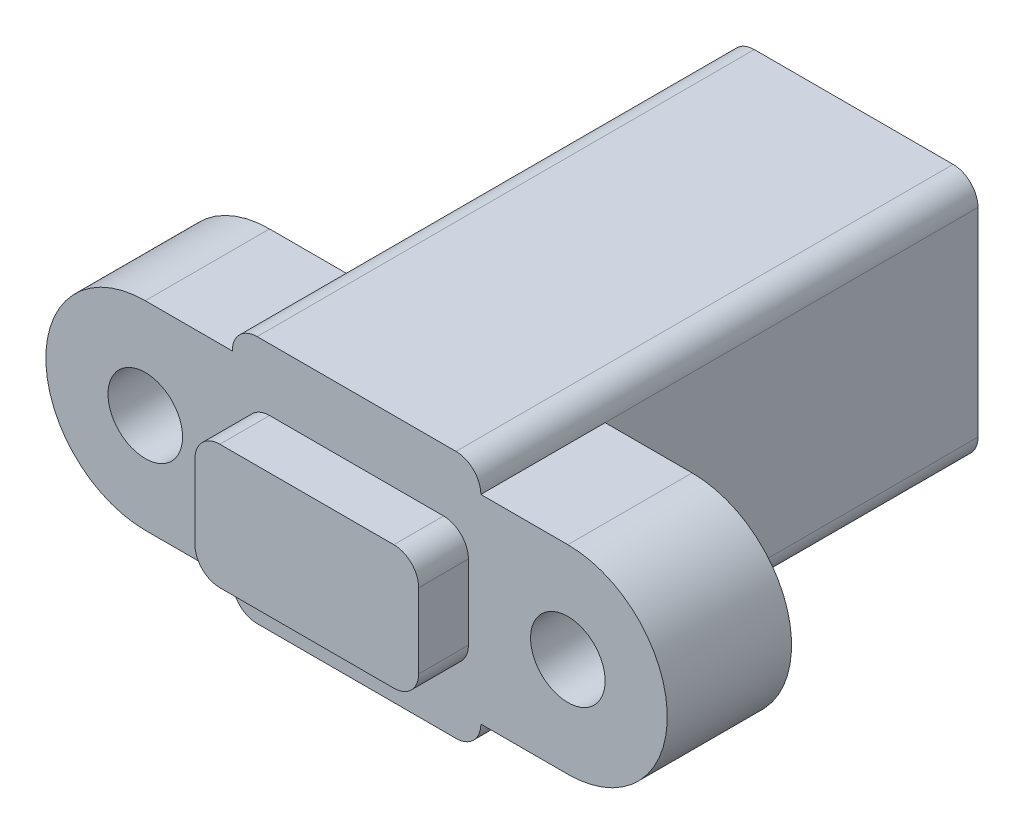
ISO-10303-21;
HEADER;
FILE_DESCRIPTION(('STEP AP214'),'2;1');
FILE_NAME('part.step','',(''),(''),'','','');
FILE_SCHEMA(('AUTOMOTIVE_DESIGN { 1 0 10303 214 1 1 1 1 }'));
ENDSEC;
DATA;
#1=APPLICATION_CONTEXT('core data for automotive mechanical design processes');
#2=APPLICATION_PROTOCOL_DEFINITION('international standard','automotive_design',2000,#1);
#3=PRODUCT_CONTEXT('',#1,'mechanical');
#4=PRODUCT('Part','Part','',(#3));
#5=PRODUCT_RELATED_PRODUCT_CATEGORY('part','',(#4));
#6=PRODUCT_DEFINITION_FORMATION('','',#4);
#7=PRODUCT_DEFINITION_CONTEXT('part definition',#1,'design');
#8=PRODUCT_DEFINITION('design','',#6,#7);
#9=PRODUCT_DEFINITION_SHAPE('','',#8);
#10=(LENGTH_UNIT() NAMED_UNIT(*) SI_UNIT(.MILLI.,.METRE.));
#11=(NAMED_UNIT(*) PLANE_ANGLE_UNIT() SI_UNIT($,.RADIAN.));
#12=(NAMED_UNIT(*) SI_UNIT($,.STERADIAN.) SOLID_ANGLE_UNIT());
#13=UNCERTAINTY_MEASURE_WITH_UNIT(LENGTH_MEASURE(1.E-05),#10,'distance_accuracy_value','');
#14=(GEOMETRIC_REPRESENTATION_CONTEXT(3) GLOBAL_UNCERTAINTY_ASSIGNED_CONTEXT((#13)) GLOBAL_UNIT_ASSIGNED_CONTEXT((#10,
#11,#12)) REPRESENTATION_CONTEXT('',''));
#15=CARTESIAN_POINT('',(0.,0.,0.));
#16=DIRECTION('',(0.,0.,1.));
#17=DIRECTION('',(1.,0.,0.));
#18=AXIS2_PLACEMENT_3D('',#15,#16,#17);
#19=CARTESIAN_POINT('',(0.,0.,0.));
#20=DIRECTION('',(0.,0.,1.));
#21=DIRECTION('',(1.,0.,0.));
#22=AXIS2_PLACEMENT_3D('',#19,#20,#21);
#23=PLANE('',#22);
#24=CARTESIAN_POINT('',(0.,0.,0.));
#25=DIRECTION('',(0.,0.,1.));
#26=DIRECTION('',(1.,0.,0.));
#27=AXIS2_PLACEMENT_3D('',#24,#25,#26);
#28=CIRCLE('',#27,1.5);
#29=CARTESIAN_POINT('',(1.5,0.,0.));
#30=VERTEX_POINT('',#29);
#31=EDGE_CURVE('E303',#30,#30,#28,.T.);
#32=ORIENTED_EDGE('',*,*,#31,.T.);
#33=EDGE_LOOP('',(#32));
#34=FACE_BOUND('',#33,.T.);
#35=DIRECTION('',(0.,-1.,0.));
#36=VECTOR('',#35,1.);
#37=CARTESIAN_POINT('',(-3.5,0.,0.));
#38=LINE('',#37,#36);
#39=CARTESIAN_POINT('',(-3.5,4.,0.));
#40=VERTEX_POINT('',#39);
#41=CARTESIAN_POINT('',(-3.5,-4.,0.));
#42=VERTEX_POINT('',#41);
#43=EDGE_CURVE('E201',#40,#42,#38,.T.);
#44=ORIENTED_EDGE('',*,*,#43,.F.);
#45=DIRECTION('',(-1.,0.,0.));
#46=VECTOR('',#45,1.);
#47=CARTESIAN_POINT('',(0.,4.,0.));
#48=LINE('',#47,#46);
#49=CARTESIAN_POINT('',(0.,4.,0.));
#50=VERTEX_POINT('',#49);
#51=EDGE_CURVE('E337',#50,#40,#48,.T.);
#52=ORIENTED_EDGE('',*,*,#51,.F.);
#53=CARTESIAN_POINT('',(0.,0.,0.));
#54=DIRECTION('',(0.,0.,1.));
#55=DIRECTION('',(1.,0.,0.));
#56=AXIS2_PLACEMENT_3D('',#53,#54,#55);
#57=CIRCLE('',#56,4.);
#58=CARTESIAN_POINT('',(0.,-4.,0.));
#59=VERTEX_POINT('',#58);
#60=EDGE_CURVE('E335',#59,#50,#57,.T.);
#61=ORIENTED_EDGE('',*,*,#60,.F.);
#62=DIRECTION('',(-1.,0.,0.));
#63=VECTOR('',#62,1.);
#64=CARTESIAN_POINT('',(0.,-4.,0.));
#65=LINE('',#64,#63);
#66=EDGE_CURVE('E299',#59,#42,#65,.T.);
#67=ORIENTED_EDGE('',*,*,#66,.T.);
#68=EDGE_LOOP('',(#44,#52,#61,#67));
#69=FACE_BOUND('',#68,.T.);
#70=ADVANCED_FACE('F35',(#34,#69),#23,.F.);
#71=CARTESIAN_POINT('',(-4.5,-4.,5.));
#72=DIRECTION('',(0.,0.,-1.));
#73=DIRECTION('',(-1.,0.,0.));
#74=AXIS2_PLACEMENT_3D('',#71,#72,#73);
#75=CYLINDRICAL_SURFACE('',#74,1.);
#76=DIRECTION('',(0.,0.,-1.));
#77=VECTOR('',#76,1.);
#78=CARTESIAN_POINT('',(-4.50000000000001,-5.,5.));
#79=LINE('',#78,#77);
#80=CARTESIAN_POINT('',(-4.50000000000001,-5.,5.));
#81=VERTEX_POINT('',#80);
#82=CARTESIAN_POINT('',(-4.50000000000001,-5.,-15.));
#83=VERTEX_POINT('',#82);
#84=EDGE_CURVE('E333',#81,#83,#79,.T.);
#85=ORIENTED_EDGE('',*,*,#84,.T.);
#86=CARTESIAN_POINT('',(-4.5,-4.,-15.));
#87=DIRECTION('',(0.,0.,1.));
#88=DIRECTION('',(1.,0.,0.));
#89=AXIS2_PLACEMENT_3D('',#86,#87,#88);
#90=CIRCLE('',#89,1.);
#91=CARTESIAN_POINT('',(-3.5,-4.,-15.));
#92=VERTEX_POINT('',#91);
#93=EDGE_CURVE('E217',#83,#92,#90,.T.);
#94=ORIENTED_EDGE('',*,*,#93,.T.);
#95=DIRECTION('',(0.,0.,1.));
#96=VECTOR('',#95,1.);
#97=CARTESIAN_POINT('',(-3.5,-4.,-15.));
#98=LINE('',#97,#96);
#99=EDGE_CURVE('E232',#92,#42,#98,.T.);
#100=ORIENTED_EDGE('',*,*,#99,.T.);
#101=DIRECTION('',(0.,0.,-1.));
#102=VECTOR('',#101,1.);
#103=CARTESIAN_POINT('',(-3.5,-4.,5.));
#104=LINE('',#103,#102);
#105=CARTESIAN_POINT('',(-3.5,-4.,5.));
#106=VERTEX_POINT('',#105);
#107=EDGE_CURVE('E11',#106,#42,#104,.T.);
#108=ORIENTED_EDGE('',*,*,#107,.F.);
#109=CARTESIAN_POINT('',(-4.5,-4.,5.));
#110=DIRECTION('',(0.,0.,1.));
#111=DIRECTION('',(1.,0.,0.));
#112=AXIS2_PLACEMENT_3D('',#109,#110,#111);
#113=CIRCLE('',#112,1.);
#114=EDGE_CURVE('E300',#81,#106,#113,.T.);
#115=ORIENTED_EDGE('',*,*,#114,.F.);
#116=EDGE_LOOP('',(#85,#94,#100,#108,#115));
#117=FACE_BOUND('',#116,.T.);
#118=ADVANCED_FACE('F37',(#117),#75,.T.);
#119=CARTESIAN_POINT('',(0.,-4.,5.));
#120=DIRECTION('',(0.,-1.,0.));
#121=DIRECTION('',(1.,0.,0.));
#122=AXIS2_PLACEMENT_3D('',#119,#120,#121);
#123=PLANE('',#122);
#124=ORIENTED_EDGE('',*,*,#66,.F.);
#125=DIRECTION('',(0.,0.,-1.));
#126=VECTOR('',#125,1.);
#127=CARTESIAN_POINT('',(0.,-4.,5.));
#128=LINE('',#127,#126);
#129=CARTESIAN_POINT('',(0.,-4.,5.));
#130=VERTEX_POINT('',#129);
#131=EDGE_CURVE('E43',#130,#59,#128,.T.);
#132=ORIENTED_EDGE('',*,*,#131,.F.);
#133=DIRECTION('',(-1.,0.,0.));
#134=VECTOR('',#133,1.);
#135=CARTESIAN_POINT('',(0.,-4.,5.));
#136=LINE('',#135,#134);
#137=EDGE_CURVE('E302',#130,#106,#136,.T.);
#138=ORIENTED_EDGE('',*,*,#137,.T.);
#139=ORIENTED_EDGE('',*,*,#107,.T.);
#140=EDGE_LOOP('',(#124,#132,#138,#139));
#141=FACE_BOUND('',#140,.T.);
#142=ADVANCED_FACE('F381',(#141),#123,.T.);
#143=CARTESIAN_POINT('',(0.,0.,5.));
#144=DIRECTION('',(0.,0.,-1.));
#145=DIRECTION('',(-1.,0.,0.));
#146=AXIS2_PLACEMENT_3D('',#143,#144,#145);
#147=CYLINDRICAL_SURFACE('',#146,4.);
#148=ORIENTED_EDGE('',*,*,#60,.T.);
#149=DIRECTION('',(0.,0.,-1.));
#150=VECTOR('',#149,1.);
#151=CARTESIAN_POINT('',(0.,4.,5.));
#152=LINE('',#151,#150);
#153=CARTESIAN_POINT('',(0.,4.,5.));
#154=VERTEX_POINT('',#153);
#155=EDGE_CURVE('E369',#154,#50,#152,.T.);
#156=ORIENTED_EDGE('',*,*,#155,.F.);
#157=CARTESIAN_POINT('',(0.,0.,5.));
#158=DIRECTION('',(0.,0.,1.));
#159=DIRECTION('',(1.,0.,0.));
#160=AXIS2_PLACEMENT_3D('',#157,#158,#159);
#161=CIRCLE('',#160,4.);
#162=EDGE_CURVE('E306',#130,#154,#161,.T.);
#163=ORIENTED_EDGE('',*,*,#162,.F.);
#164=ORIENTED_EDGE('',*,*,#131,.T.);
#165=EDGE_LOOP('',(#148,#156,#163,#164));
#166=FACE_BOUND('',#165,.T.);
#167=ADVANCED_FACE('F374',(#166),#147,.T.);
#168=CARTESIAN_POINT('',(0.,4.,5.));
#169=DIRECTION('',(0.,-1.,0.));
#170=DIRECTION('',(1.,0.,0.));
#171=AXIS2_PLACEMENT_3D('',#168,#169,#170);
#172=PLANE('',#171);
#173=ORIENTED_EDGE('',*,*,#51,.T.);
#174=DIRECTION('',(0.,0.,-1.));
#175=VECTOR('',#174,1.);
#176=CARTESIAN_POINT('',(-3.5,4.,5.));
#177=LINE('',#176,#175);
#178=CARTESIAN_POINT('',(-3.5,4.,5.));
#179=VERTEX_POINT('',#178);
#180=EDGE_CURVE('E366',#179,#40,#177,.T.);
#181=ORIENTED_EDGE('',*,*,#180,.F.);
#182=DIRECTION('',(-1.,0.,0.));
#183=VECTOR('',#182,1.);
#184=CARTESIAN_POINT('',(0.,4.,5.));
#185=LINE('',#184,#183);
#186=EDGE_CURVE('E308',#154,#179,#185,.T.);
#187=ORIENTED_EDGE('',*,*,#186,.F.);
#188=ORIENTED_EDGE('',*,*,#155,.T.);
#189=EDGE_LOOP('',(#173,#181,#187,#188));
#190=FACE_BOUND('',#189,.T.);
#191=ADVANCED_FACE('F397',(#190),#172,.F.);
#192=CARTESIAN_POINT('',(-4.5,4.,5.));
#193=DIRECTION('',(0.,0.,-1.));
#194=DIRECTION('',(-1.,0.,0.));
#195=AXIS2_PLACEMENT_3D('',#192,#193,#194);
#196=CYLINDRICAL_SURFACE('',#195,1.);
#197=ORIENTED_EDGE('',*,*,#180,.T.);
#198=DIRECTION('',(0.,0.,1.));
#199=VECTOR('',#198,1.);
#200=CARTESIAN_POINT('',(-3.5,4.,-15.));
#201=LINE('',#200,#199);
#202=CARTESIAN_POINT('',(-3.5,4.,-15.));
#203=VERTEX_POINT('',#202);
#204=EDGE_CURVE('E229',#203,#40,#201,.T.);
#205=ORIENTED_EDGE('',*,*,#204,.F.);
#206=CARTESIAN_POINT('',(-4.5,4.,-15.));
#207=DIRECTION('',(0.,0.,1.));
#208=DIRECTION('',(1.,0.,0.));
#209=AXIS2_PLACEMENT_3D('',#206,#207,#208);
#210=CIRCLE('',#209,1.);
#211=CARTESIAN_POINT('',(-4.50000000000001,5.,-15.));
#212=VERTEX_POINT('',#211);
#213=EDGE_CURVE('E222',#212,#203,#210,.F.);
#214=ORIENTED_EDGE('',*,*,#213,.F.);
#215=DIRECTION('',(0.,0.,-1.));
#216=VECTOR('',#215,1.);
#217=CARTESIAN_POINT('',(-4.50000000000001,5.,5.));
#218=LINE('',#217,#216);
#219=CARTESIAN_POINT('',(-4.50000000000001,5.,5.));
#220=VERTEX_POINT('',#219);
#221=EDGE_CURVE('E193',#220,#212,#218,.T.);
#222=ORIENTED_EDGE('',*,*,#221,.F.);
#223=CARTESIAN_POINT('',(-4.5,4.,5.));
#224=DIRECTION('',(0.,0.,1.));
#225=DIRECTION('',(1.,0.,0.));
#226=AXIS2_PLACEMENT_3D('',#223,#224,#225);
#227=CIRCLE('',#226,1.);
#228=EDGE_CURVE('E310',#220,#179,#227,.F.);
#229=ORIENTED_EDGE('',*,*,#228,.T.);
#230=EDGE_LOOP('',(#197,#205,#214,#222,#229));
#231=FACE_BOUND('',#230,.T.);
#232=ADVANCED_FACE('F393',(#231),#196,.T.);
#233=CARTESIAN_POINT('',(0.,5.,5.));
#234=DIRECTION('',(0.,1.,0.));
#235=DIRECTION('',(0.,0.,1.));
#236=AXIS2_PLACEMENT_3D('',#233,#234,#235);
#237=PLANE('',#236);
#238=ORIENTED_EDGE('',*,*,#221,.T.);
#239=DIRECTION('',(1.,0.,0.));
#240=VECTOR('',#239,1.);
#241=CARTESIAN_POINT('',(0.,5.,-15.));
#242=LINE('',#241,#240);
#243=CARTESIAN_POINT('',(-12.5,5.,-15.));
#244=VERTEX_POINT('',#243);
#245=EDGE_CURVE('E197',#244,#212,#242,.T.);
#246=ORIENTED_EDGE('',*,*,#245,.F.);
#247=DIRECTION('',(0.,0.,-1.));
#248=VECTOR('',#247,1.);
#249=CARTESIAN_POINT('',(-12.5,5.,5.));
#250=LINE('',#249,#248);
#251=CARTESIAN_POINT('',(-12.5,5.,5.));
#252=VERTEX_POINT('',#251);
#253=EDGE_CURVE('E182',#252,#244,#250,.T.);
#254=ORIENTED_EDGE('',*,*,#253,.F.);
#255=DIRECTION('',(1.,0.,0.));
#256=VECTOR('',#255,1.);
#257=CARTESIAN_POINT('',(0.,5.,5.));
#258=LINE('',#257,#256);
#259=EDGE_CURVE('E313',#252,#220,#258,.T.);
#260=ORIENTED_EDGE('',*,*,#259,.T.);
#261=EDGE_LOOP('',(#238,#246,#254,#260));
#262=FACE_BOUND('',#261,.T.);
#263=ADVANCED_FACE('F198',(#262),#237,.T.);
#264=CARTESIAN_POINT('',(-12.5,4.,5.));
#265=DIRECTION('',(0.,0.,-1.));
#266=DIRECTION('',(-1.,0.,0.));
#267=AXIS2_PLACEMENT_3D('',#264,#265,#266);
#268=CYLINDRICAL_SURFACE('',#267,1.);
#269=ORIENTED_EDGE('',*,*,#253,.T.);
#270=CARTESIAN_POINT('',(-12.5,4.,-15.));
#271=DIRECTION('',(0.,0.,1.));
#272=DIRECTION('',(1.,0.,0.));
#273=AXIS2_PLACEMENT_3D('',#270,#271,#272);
#274=CIRCLE('',#273,1.);
#275=CARTESIAN_POINT('',(-13.5,4.,-15.));
#276=VERTEX_POINT('',#275);
#277=EDGE_CURVE('E187',#244,#276,#274,.T.);
#278=ORIENTED_EDGE('',*,*,#277,.T.);
#279=DIRECTION('',(0.,0.,1.));
#280=VECTOR('',#279,1.);
#281=CARTESIAN_POINT('',(-13.5,4.,-15.));
#282=LINE('',#281,#280);
#283=CARTESIAN_POINT('',(-13.5,4.,0.));
#284=VERTEX_POINT('',#283);
#285=EDGE_CURVE('E224',#276,#284,#282,.T.);
#286=ORIENTED_EDGE('',*,*,#285,.T.);
#287=DIRECTION('',(0.,0.,-1.));
#288=VECTOR('',#287,1.);
#289=CARTESIAN_POINT('',(-13.5,4.,5.));
#290=LINE('',#289,#288);
#291=CARTESIAN_POINT('',(-13.5,4.,5.));
#292=VERTEX_POINT('',#291);
#293=EDGE_CURVE('E194',#292,#284,#290,.T.);
#294=ORIENTED_EDGE('',*,*,#293,.F.);
#295=CARTESIAN_POINT('',(-12.5,4.,5.));
#296=DIRECTION('',(0.,0.,1.));
#297=DIRECTION('',(1.,0.,0.));
#298=AXIS2_PLACEMENT_3D('',#295,#296,#297);
#299=CIRCLE('',#298,1.);
#300=EDGE_CURVE('E189',#252,#292,#299,.T.);
#301=ORIENTED_EDGE('',*,*,#300,.F.);
#302=EDGE_LOOP('',(#269,#278,#286,#294,#301));
#303=FACE_BOUND('',#302,.T.);
#304=ADVANCED_FACE('F184',(#303),#268,.T.);
#305=CARTESIAN_POINT('',(0.,4.,5.));
#306=DIRECTION('',(0.,-1.,0.));
#307=DIRECTION('',(1.,0.,0.));
#308=AXIS2_PLACEMENT_3D('',#305,#306,#307);
#309=PLANE('',#308);
#310=DIRECTION('',(-1.,0.,0.));
#311=VECTOR('',#310,1.);
#312=CARTESIAN_POINT('',(0.,4.,0.));
#313=LINE('',#312,#311);
#314=CARTESIAN_POINT('',(-17.,4.,0.));
#315=VERTEX_POINT('',#314);
#316=EDGE_CURVE('E340',#284,#315,#313,.T.);
#317=ORIENTED_EDGE('',*,*,#316,.T.);
#318=DIRECTION('',(0.,0.,-1.));
#319=VECTOR('',#318,1.);
#320=CARTESIAN_POINT('',(-17.,4.,5.));
#321=LINE('',#320,#319);
#322=CARTESIAN_POINT('',(-17.,4.,5.));
#323=VERTEX_POINT('',#322);
#324=EDGE_CURVE('E361',#323,#315,#321,.T.);
#325=ORIENTED_EDGE('',*,*,#324,.F.);
#326=DIRECTION('',(-1.,0.,0.));
#327=VECTOR('',#326,1.);
#328=CARTESIAN_POINT('',(0.,4.,5.));
#329=LINE('',#328,#327);
#330=EDGE_CURVE('E316',#292,#323,#329,.T.);
#331=ORIENTED_EDGE('',*,*,#330,.F.);
#332=ORIENTED_EDGE('',*,*,#293,.T.);
#333=EDGE_LOOP('',(#317,#325,#331,#332));
#334=FACE_BOUND('',#333,.T.);
#335=ADVANCED_FACE('F418',(#334),#309,.F.);
#336=CARTESIAN_POINT('',(-17.,0.,5.));
#337=DIRECTION('',(0.,0.,-1.));
#338=DIRECTION('',(-1.,0.,0.));
#339=AXIS2_PLACEMENT_3D('',#336,#337,#338);
#340=CYLINDRICAL_SURFACE('',#339,4.);
#341=CARTESIAN_POINT('',(-17.,0.,0.));
#342=DIRECTION('',(0.,0.,1.));
#343=DIRECTION('',(1.,0.,0.));
#344=AXIS2_PLACEMENT_3D('',#341,#342,#343);
#345=CIRCLE('',#344,4.);
#346=CARTESIAN_POINT('',(-17.,-4.,0.));
#347=VERTEX_POINT('',#346);
#348=EDGE_CURVE('E342',#315,#347,#345,.T.);
#349=ORIENTED_EDGE('',*,*,#348,.T.);
#350=DIRECTION('',(0.,0.,-1.));
#351=VECTOR('',#350,1.);
#352=CARTESIAN_POINT('',(-17.,-4.,5.));
#353=LINE('',#352,#351);
#354=CARTESIAN_POINT('',(-17.,-4.,5.));
#355=VERTEX_POINT('',#354);
#356=EDGE_CURVE('E359',#355,#347,#353,.T.);
#357=ORIENTED_EDGE('',*,*,#356,.F.);
#358=CARTESIAN_POINT('',(-17.,0.,5.));
#359=DIRECTION('',(0.,0.,1.));
#360=DIRECTION('',(1.,0.,0.));
#361=AXIS2_PLACEMENT_3D('',#358,#359,#360);
#362=CIRCLE('',#361,4.);
#363=EDGE_CURVE('E318',#323,#355,#362,.T.);
#364=ORIENTED_EDGE('',*,*,#363,.F.);
#365=ORIENTED_EDGE('',*,*,#324,.T.);
#366=EDGE_LOOP('',(#349,#357,#364,#365));
#367=FACE_BOUND('',#366,.T.);
#368=ADVANCED_FACE('F422',(#367),#340,.T.);
#369=CARTESIAN_POINT('',(0.,-4.,5.));
#370=DIRECTION('',(0.,-1.,0.));
#371=DIRECTION('',(1.,0.,0.));
#372=AXIS2_PLACEMENT_3D('',#369,#370,#371);
#373=PLANE('',#372);
#374=DIRECTION('',(-1.,0.,0.));
#375=VECTOR('',#374,1.);
#376=CARTESIAN_POINT('',(0.,-4.,0.));
#377=LINE('',#376,#375);
#378=CARTESIAN_POINT('',(-13.5,-4.,0.));
#379=VERTEX_POINT('',#378);
#380=EDGE_CURVE('E345',#379,#347,#377,.T.);
#381=ORIENTED_EDGE('',*,*,#380,.F.);
#382=DIRECTION('',(0.,0.,-1.));
#383=VECTOR('',#382,1.);
#384=CARTESIAN_POINT('',(-13.5,-4.,5.));
#385=LINE('',#384,#383);
#386=CARTESIAN_POINT('',(-13.5,-4.,5.));
#387=VERTEX_POINT('',#386);
#388=EDGE_CURVE('E356',#387,#379,#385,.T.);
#389=ORIENTED_EDGE('',*,*,#388,.F.);
#390=DIRECTION('',(-1.,0.,0.));
#391=VECTOR('',#390,1.);
#392=CARTESIAN_POINT('',(0.,-4.,5.));
#393=LINE('',#392,#391);
#394=EDGE_CURVE('E320',#387,#355,#393,.T.);
#395=ORIENTED_EDGE('',*,*,#394,.T.);
#396=ORIENTED_EDGE('',*,*,#356,.T.);
#397=EDGE_LOOP('',(#381,#389,#395,#396));
#398=FACE_BOUND('',#397,.T.);
#399=ADVANCED_FACE('F426',(#398),#373,.T.);
#400=CARTESIAN_POINT('',(-12.5,-4.,5.));
#401=DIRECTION('',(0.,0.,-1.));
#402=DIRECTION('',(-1.,0.,0.));
#403=AXIS2_PLACEMENT_3D('',#400,#401,#402);
#404=CYLINDRICAL_SURFACE('',#403,0.999999999999999);
#405=ORIENTED_EDGE('',*,*,#388,.T.);
#406=DIRECTION('',(0.,0.,1.));
#407=VECTOR('',#406,1.);
#408=CARTESIAN_POINT('',(-13.5,-4.,-15.));
#409=LINE('',#408,#407);
#410=CARTESIAN_POINT('',(-13.5,-4.,-15.));
#411=VERTEX_POINT('',#410);
#412=EDGE_CURVE('E235',#411,#379,#409,.T.);
#413=ORIENTED_EDGE('',*,*,#412,.F.);
#414=CARTESIAN_POINT('',(-12.5,-4.,-15.));
#415=DIRECTION('',(0.,0.,1.));
#416=DIRECTION('',(1.,0.,0.));
#417=AXIS2_PLACEMENT_3D('',#414,#415,#416);
#418=CIRCLE('',#417,0.999999999999999);
#419=CARTESIAN_POINT('',(-12.5,-5.,-15.));
#420=VERTEX_POINT('',#419);
#421=EDGE_CURVE('E209',#411,#420,#418,.T.);
#422=ORIENTED_EDGE('',*,*,#421,.T.);
#423=DIRECTION('',(0.,0.,-1.));
#424=VECTOR('',#423,1.);
#425=CARTESIAN_POINT('',(-12.5,-5.,5.));
#426=LINE('',#425,#424);
#427=CARTESIAN_POINT('',(-12.5,-5.,5.));
#428=VERTEX_POINT('',#427);
#429=EDGE_CURVE('E354',#428,#420,#426,.T.);
#430=ORIENTED_EDGE('',*,*,#429,.F.);
#431=CARTESIAN_POINT('',(-12.5,-4.,5.));
#432=DIRECTION('',(0.,0.,1.));
#433=DIRECTION('',(1.,0.,0.));
#434=AXIS2_PLACEMENT_3D('',#431,#432,#433);
#435=CIRCLE('',#434,0.999999999999999);
#436=EDGE_CURVE('E323',#387,#428,#435,.T.);
#437=ORIENTED_EDGE('',*,*,#436,.F.);
#438=EDGE_LOOP('',(#405,#413,#422,#430,#437));
#439=FACE_BOUND('',#438,.T.);
#440=ADVANCED_FACE('F409',(#439),#404,.T.);
#441=CARTESIAN_POINT('',(-17.,0.,5.));
#442=DIRECTION('',(0.,0.,-1.));
#443=DIRECTION('',(-1.,0.,0.));
#444=AXIS2_PLACEMENT_3D('',#441,#442,#443);
#445=CYLINDRICAL_SURFACE('',#444,1.5);
#446=CARTESIAN_POINT('',(-17.,0.,5.));
#447=DIRECTION('',(0.,0.,1.));
#448=DIRECTION('',(1.,0.,0.));
#449=AXIS2_PLACEMENT_3D('',#446,#447,#448);
#450=CIRCLE('',#449,1.5);
#451=CARTESIAN_POINT('',(-15.5,0.,5.));
#452=VERTEX_POINT('',#451);
#453=EDGE_CURVE('E327',#452,#452,#450,.T.);
#454=ORIENTED_EDGE('',*,*,#453,.T.);
#455=EDGE_LOOP('',(#454));
#456=FACE_BOUND('',#455,.T.);
#457=CARTESIAN_POINT('',(-17.,0.,0.));
#458=DIRECTION('',(0.,0.,1.));
#459=DIRECTION('',(1.,0.,0.));
#460=AXIS2_PLACEMENT_3D('',#457,#458,#459);
#461=CIRCLE('',#460,1.5);
#462=CARTESIAN_POINT('',(-15.5,0.,0.));
#463=VERTEX_POINT('',#462);
#464=EDGE_CURVE('E348',#463,#463,#461,.T.);
#465=ORIENTED_EDGE('',*,*,#464,.F.);
#466=EDGE_LOOP('',(#465));
#467=FACE_BOUND('',#466,.T.);
#468=ADVANCED_FACE('F435',(#456,#467),#445,.F.);
#469=CARTESIAN_POINT('',(0.,-5.,5.));
#470=DIRECTION('',(0.,1.,0.));
#471=DIRECTION('',(-1.,0.,0.));
#472=AXIS2_PLACEMENT_3D('',#469,#470,#471);
#473=PLANE('',#472);
#474=ORIENTED_EDGE('',*,*,#429,.T.);
#475=DIRECTION('',(1.,0.,0.));
#476=VECTOR('',#475,1.);
#477=CARTESIAN_POINT('',(0.,-5.,-15.));
#478=LINE('',#477,#476);
#479=EDGE_CURVE('E214',#420,#83,#478,.T.);
#480=ORIENTED_EDGE('',*,*,#479,.T.);
#481=ORIENTED_EDGE('',*,*,#84,.F.);
#482=DIRECTION('',(1.,0.,0.));
#483=VECTOR('',#482,1.);
#484=CARTESIAN_POINT('',(0.,-5.,5.));
#485=LINE('',#484,#483);
#486=EDGE_CURVE('E325',#428,#81,#485,.T.);
#487=ORIENTED_EDGE('',*,*,#486,.F.);
#488=EDGE_LOOP('',(#474,#480,#481,#487));
#489=FACE_BOUND('',#488,.T.);
#490=ADVANCED_FACE('F405',(#489),#473,.F.);
#491=CARTESIAN_POINT('',(0.,0.,5.));
#492=DIRECTION('',(0.,0.,-1.));
#493=DIRECTION('',(-1.,0.,0.));
#494=AXIS2_PLACEMENT_3D('',#491,#492,#493);
#495=CYLINDRICAL_SURFACE('',#494,1.5);
#496=CARTESIAN_POINT('',(0.,0.,5.));
#497=DIRECTION('',(0.,0.,1.));
#498=DIRECTION('',(1.,0.,0.));
#499=AXIS2_PLACEMENT_3D('',#496,#497,#498);
#500=CIRCLE('',#499,1.5);
#501=CARTESIAN_POINT('',(1.5,0.,5.));
#502=VERTEX_POINT('',#501);
#503=EDGE_CURVE('E330',#502,#502,#500,.T.);
#504=ORIENTED_EDGE('',*,*,#503,.T.);
#505=EDGE_LOOP('',(#504));
#506=FACE_BOUND('',#505,.T.);
#507=ORIENTED_EDGE('',*,*,#31,.F.);
#508=EDGE_LOOP('',(#507));
#509=FACE_BOUND('',#508,.T.);
#510=ADVANCED_FACE('F443',(#506,#509),#495,.F.);
#511=CARTESIAN_POINT('',(0.,0.,5.));
#512=DIRECTION('',(0.,0.,1.));
#513=DIRECTION('',(1.,0.,0.));
#514=AXIS2_PLACEMENT_3D('',#511,#512,#513);
#515=PLANE('',#514);
#516=CARTESIAN_POINT('',(-5.,1.5,5.));
#517=DIRECTION('',(0.,0.,1.));
#518=DIRECTION('',(-1.,0.,0.));
#519=AXIS2_PLACEMENT_3D('',#516,#517,#518);
#520=CIRCLE('',#519,1.);
#521=CARTESIAN_POINT('',(-4.,1.49999999999999,5.));
#522=VERTEX_POINT('',#521);
#523=CARTESIAN_POINT('',(-5.00000000000001,2.5,5.));
#524=VERTEX_POINT('',#523);
#525=EDGE_CURVE('E50',#522,#524,#520,.T.);
#526=ORIENTED_EDGE('',*,*,#525,.F.);
#527=DIRECTION('',(0.,1.,0.));
#528=VECTOR('',#527,1.);
#529=CARTESIAN_POINT('',(-4.,-1.5,5.));
#530=LINE('',#529,#528);
#531=CARTESIAN_POINT('',(-4.,-1.5,5.));
#532=VERTEX_POINT('',#531);
#533=EDGE_CURVE('E54',#532,#522,#530,.T.);
#534=ORIENTED_EDGE('',*,*,#533,.F.);
#535=CARTESIAN_POINT('',(-5.,-1.5,5.));
#536=DIRECTION('',(0.,0.,1.));
#537=DIRECTION('',(1.,0.,0.));
#538=AXIS2_PLACEMENT_3D('',#535,#536,#537);
#539=CIRCLE('',#538,1.);
#540=CARTESIAN_POINT('',(-5.00000000000001,-2.5,5.));
#541=VERTEX_POINT('',#540);
#542=EDGE_CURVE('E273',#541,#532,#539,.T.);
#543=ORIENTED_EDGE('',*,*,#542,.F.);
#544=DIRECTION('',(1.,0.,0.));
#545=VECTOR('',#544,1.);
#546=CARTESIAN_POINT('',(-12.,-2.5,5.));
#547=LINE('',#546,#545);
#548=CARTESIAN_POINT('',(-12.,-2.5,5.));
#549=VERTEX_POINT('',#548);
#550=EDGE_CURVE('E270',#549,#541,#547,.T.);
#551=ORIENTED_EDGE('',*,*,#550,.F.);
#552=CARTESIAN_POINT('',(-12.,-1.5,5.));
#553=DIRECTION('',(0.,0.,1.));
#554=DIRECTION('',(-1.,0.,0.));
#555=AXIS2_PLACEMENT_3D('',#552,#553,#554);
#556=CIRCLE('',#555,1.);
#557=CARTESIAN_POINT('',(-13.,-1.5,5.));
#558=VERTEX_POINT('',#557);
#559=EDGE_CURVE('E267',#558,#549,#556,.T.);
#560=ORIENTED_EDGE('',*,*,#559,.F.);
#561=DIRECTION('',(0.,-1.,0.));
#562=VECTOR('',#561,1.);
#563=CARTESIAN_POINT('',(-13.,-1.5,5.));
#564=LINE('',#563,#562);
#565=CARTESIAN_POINT('',(-13.,1.49999999999999,5.));
#566=VERTEX_POINT('',#565);
#567=EDGE_CURVE('E264',#566,#558,#564,.T.);
#568=ORIENTED_EDGE('',*,*,#567,.F.);
#569=CARTESIAN_POINT('',(-12.,1.5,5.));
#570=DIRECTION('',(0.,0.,1.));
#571=DIRECTION('',(-1.,0.,0.));
#572=AXIS2_PLACEMENT_3D('',#569,#570,#571);
#573=CIRCLE('',#572,1.);
#574=CARTESIAN_POINT('',(-12.,2.5,5.));
#575=VERTEX_POINT('',#574);
#576=EDGE_CURVE('E261',#575,#566,#573,.T.);
#577=ORIENTED_EDGE('',*,*,#576,.F.);
#578=DIRECTION('',(-1.,0.,0.));
#579=VECTOR('',#578,1.);
#580=CARTESIAN_POINT('',(-12.,2.5,5.));
#581=LINE('',#580,#579);
#582=EDGE_CURVE('E258',#524,#575,#581,.T.);
#583=ORIENTED_EDGE('',*,*,#582,.F.);
#584=EDGE_LOOP('',(#526,#534,#543,#551,#560,#568,#577,#583));
#585=FACE_BOUND('',#584,.T.);
#586=ORIENTED_EDGE('',*,*,#114,.T.);
#587=ORIENTED_EDGE('',*,*,#137,.F.);
#588=ORIENTED_EDGE('',*,*,#162,.T.);
#589=ORIENTED_EDGE('',*,*,#186,.T.);
#590=ORIENTED_EDGE('',*,*,#228,.F.);
#591=ORIENTED_EDGE('',*,*,#259,.F.);
#592=ORIENTED_EDGE('',*,*,#300,.T.);
#593=ORIENTED_EDGE('',*,*,#330,.T.);
#594=ORIENTED_EDGE('',*,*,#363,.T.);
#595=ORIENTED_EDGE('',*,*,#394,.F.);
#596=ORIENTED_EDGE('',*,*,#436,.T.);
#597=ORIENTED_EDGE('',*,*,#486,.T.);
#598=EDGE_LOOP('',(#586,#587,#588,#589,#590,#591,#592,#593,#594,#595,#596,#597));
#599=FACE_BOUND('',#598,.T.);
#600=ORIENTED_EDGE('',*,*,#453,.F.);
#601=EDGE_LOOP('',(#600));
#602=FACE_BOUND('',#601,.T.);
#603=ORIENTED_EDGE('',*,*,#503,.F.);
#604=EDGE_LOOP('',(#603));
#605=FACE_BOUND('',#604,.T.);
#606=ADVANCED_FACE('F399',(#585,#599,#602,#605),#515,.T.);
#607=ORIENTED_EDGE('',*,*,#316,.F.);
#608=DIRECTION('',(0.,-1.,0.));
#609=VECTOR('',#608,1.);
#610=CARTESIAN_POINT('',(-13.5,0.,0.));
#611=LINE('',#610,#609);
#612=EDGE_CURVE('E225',#284,#379,#611,.T.);
#613=ORIENTED_EDGE('',*,*,#612,.T.);
#614=ORIENTED_EDGE('',*,*,#380,.T.);
#615=ORIENTED_EDGE('',*,*,#348,.F.);
#616=EDGE_LOOP('',(#607,#613,#614,#615));
#617=FACE_BOUND('',#616,.T.);
#618=ORIENTED_EDGE('',*,*,#464,.T.);
#619=EDGE_LOOP('',(#618));
#620=FACE_BOUND('',#619,.T.);
#621=ADVANCED_FACE('F428',(#617,#620),#23,.F.);
#622=CARTESIAN_POINT('',(-5.,1.5,7.));
#623=DIRECTION('',(0.,0.,-1.));
#624=DIRECTION('',(-1.,0.,0.));
#625=AXIS2_PLACEMENT_3D('',#622,#623,#624);
#626=CYLINDRICAL_SURFACE('',#625,1.);
#627=ORIENTED_EDGE('',*,*,#525,.T.);
#628=DIRECTION('',(0.,0.,-1.));
#629=VECTOR('',#628,1.);
#630=CARTESIAN_POINT('',(-5.00000000000001,2.5,7.));
#631=LINE('',#630,#629);
#632=CARTESIAN_POINT('',(-5.00000000000001,2.5,7.));
#633=VERTEX_POINT('',#632);
#634=EDGE_CURVE('E296',#633,#524,#631,.T.);
#635=ORIENTED_EDGE('',*,*,#634,.F.);
#636=CARTESIAN_POINT('',(-5.,1.5,7.));
#637=DIRECTION('',(0.,0.,1.));
#638=DIRECTION('',(-1.,0.,0.));
#639=AXIS2_PLACEMENT_3D('',#636,#637,#638);
#640=CIRCLE('',#639,1.);
#641=CARTESIAN_POINT('',(-4.,1.49999999999999,7.));
#642=VERTEX_POINT('',#641);
#643=EDGE_CURVE('E239',#642,#633,#640,.T.);
#644=ORIENTED_EDGE('',*,*,#643,.F.);
#645=DIRECTION('',(0.,0.,-1.));
#646=VECTOR('',#645,1.);
#647=CARTESIAN_POINT('',(-4.,1.49999999999999,7.));
#648=LINE('',#647,#646);
#649=EDGE_CURVE('E256',#642,#522,#648,.T.);
#650=ORIENTED_EDGE('',*,*,#649,.T.);
#651=EDGE_LOOP('',(#627,#635,#644,#650));
#652=FACE_BOUND('',#651,.T.);
#653=ADVANCED_FACE('F431',(#652),#626,.T.);
#654=CARTESIAN_POINT('',(-12.,2.5,7.));
#655=DIRECTION('',(0.,-1.,0.));
#656=DIRECTION('',(0.,0.,-1.));
#657=AXIS2_PLACEMENT_3D('',#654,#655,#656);
#658=PLANE('',#657);
#659=ORIENTED_EDGE('',*,*,#582,.T.);
#660=DIRECTION('',(0.,0.,-1.));
#661=VECTOR('',#660,1.);
#662=CARTESIAN_POINT('',(-12.,2.5,7.));
#663=LINE('',#662,#661);
#664=CARTESIAN_POINT('',(-12.,2.5,7.));
#665=VERTEX_POINT('',#664);
#666=EDGE_CURVE('E293',#665,#575,#663,.T.);
#667=ORIENTED_EDGE('',*,*,#666,.F.);
#668=DIRECTION('',(-1.,0.,0.));
#669=VECTOR('',#668,1.);
#670=CARTESIAN_POINT('',(-12.,2.5,7.));
#671=LINE('',#670,#669);
#672=EDGE_CURVE('E242',#633,#665,#671,.T.);
#673=ORIENTED_EDGE('',*,*,#672,.F.);
#674=ORIENTED_EDGE('',*,*,#634,.T.);
#675=EDGE_LOOP('',(#659,#667,#673,#674));
#676=FACE_BOUND('',#675,.T.);
#677=ADVANCED_FACE('F477',(#676),#658,.F.);
#678=CARTESIAN_POINT('',(-12.,1.5,7.));
#679=DIRECTION('',(0.,0.,-1.));
#680=DIRECTION('',(-1.,0.,0.));
#681=AXIS2_PLACEMENT_3D('',#678,#679,#680);
#682=CYLINDRICAL_SURFACE('',#681,1.);
#683=ORIENTED_EDGE('',*,*,#576,.T.);
#684=DIRECTION('',(0.,0.,-1.));
#685=VECTOR('',#684,1.);
#686=CARTESIAN_POINT('',(-13.,1.49999999999999,7.));
#687=LINE('',#686,#685);
#688=CARTESIAN_POINT('',(-13.,1.49999999999999,7.));
#689=VERTEX_POINT('',#688);
#690=EDGE_CURVE('E290',#689,#566,#687,.T.);
#691=ORIENTED_EDGE('',*,*,#690,.F.);
#692=CARTESIAN_POINT('',(-12.,1.5,7.));
#693=DIRECTION('',(0.,0.,1.));
#694=DIRECTION('',(-1.,0.,0.));
#695=AXIS2_PLACEMENT_3D('',#692,#693,#694);
#696=CIRCLE('',#695,1.);
#697=EDGE_CURVE('E244',#665,#689,#696,.T.);
#698=ORIENTED_EDGE('',*,*,#697,.F.);
#699=ORIENTED_EDGE('',*,*,#666,.T.);
#700=EDGE_LOOP('',(#683,#691,#698,#699));
#701=FACE_BOUND('',#700,.T.);
#702=ADVANCED_FACE('F484',(#701),#682,.T.);
#703=CARTESIAN_POINT('',(-13.,-1.5,7.));
#704=DIRECTION('',(1.,0.,0.));
#705=DIRECTION('',(0.,0.,-1.));
#706=AXIS2_PLACEMENT_3D('',#703,#704,#705);
#707=PLANE('',#706);
#708=ORIENTED_EDGE('',*,*,#567,.T.);
#709=DIRECTION('',(0.,0.,-1.));
#710=VECTOR('',#709,1.);
#711=CARTESIAN_POINT('',(-13.,-1.5,7.));
#712=LINE('',#711,#710);
#713=CARTESIAN_POINT('',(-13.,-1.5,7.));
#714=VERTEX_POINT('',#713);
#715=EDGE_CURVE('E287',#714,#558,#712,.T.);
#716=ORIENTED_EDGE('',*,*,#715,.F.);
#717=DIRECTION('',(0.,-1.,0.));
#718=VECTOR('',#717,1.);
#719=CARTESIAN_POINT('',(-13.,-1.5,7.));
#720=LINE('',#719,#718);
#721=EDGE_CURVE('E246',#689,#714,#720,.T.);
#722=ORIENTED_EDGE('',*,*,#721,.F.);
#723=ORIENTED_EDGE('',*,*,#690,.T.);
#724=EDGE_LOOP('',(#708,#716,#722,#723));
#725=FACE_BOUND('',#724,.T.);
#726=ADVANCED_FACE('F492',(#725),#707,.F.);
#727=CARTESIAN_POINT('',(-12.,-1.5,7.));
#728=DIRECTION('',(0.,0.,-1.));
#729=DIRECTION('',(-1.,0.,0.));
#730=AXIS2_PLACEMENT_3D('',#727,#728,#729);
#731=CYLINDRICAL_SURFACE('',#730,1.);
#732=ORIENTED_EDGE('',*,*,#559,.T.);
#733=DIRECTION('',(0.,0.,-1.));
#734=VECTOR('',#733,1.);
#735=CARTESIAN_POINT('',(-12.,-2.5,7.));
#736=LINE('',#735,#734);
#737=CARTESIAN_POINT('',(-12.,-2.5,7.));
#738=VERTEX_POINT('',#737);
#739=EDGE_CURVE('E284',#738,#549,#736,.T.);
#740=ORIENTED_EDGE('',*,*,#739,.F.);
#741=CARTESIAN_POINT('',(-12.,-1.5,7.));
#742=DIRECTION('',(0.,0.,1.));
#743=DIRECTION('',(-1.,0.,0.));
#744=AXIS2_PLACEMENT_3D('',#741,#742,#743);
#745=CIRCLE('',#744,1.);
#746=EDGE_CURVE('E248',#714,#738,#745,.T.);
#747=ORIENTED_EDGE('',*,*,#746,.F.);
#748=ORIENTED_EDGE('',*,*,#715,.T.);
#749=EDGE_LOOP('',(#732,#740,#747,#748));
#750=FACE_BOUND('',#749,.T.);
#751=ADVANCED_FACE('F500',(#750),#731,.T.);
#752=CARTESIAN_POINT('',(-12.,-2.5,7.));
#753=DIRECTION('',(0.,1.,0.));
#754=DIRECTION('',(0.,0.,1.));
#755=AXIS2_PLACEMENT_3D('',#752,#753,#754);
#756=PLANE('',#755);
#757=ORIENTED_EDGE('',*,*,#550,.T.);
#758=DIRECTION('',(0.,0.,-1.));
#759=VECTOR('',#758,1.);
#760=CARTESIAN_POINT('',(-5.00000000000001,-2.5,7.));
#761=LINE('',#760,#759);
#762=CARTESIAN_POINT('',(-5.00000000000001,-2.5,7.));
#763=VERTEX_POINT('',#762);
#764=EDGE_CURVE('E281',#763,#541,#761,.T.);
#765=ORIENTED_EDGE('',*,*,#764,.F.);
#766=DIRECTION('',(1.,0.,0.));
#767=VECTOR('',#766,1.);
#768=CARTESIAN_POINT('',(-12.,-2.5,7.));
#769=LINE('',#768,#767);
#770=EDGE_CURVE('E250',#738,#763,#769,.T.);
#771=ORIENTED_EDGE('',*,*,#770,.F.);
#772=ORIENTED_EDGE('',*,*,#739,.T.);
#773=EDGE_LOOP('',(#757,#765,#771,#772));
#774=FACE_BOUND('',#773,.T.);
#775=ADVANCED_FACE('F508',(#774),#756,.F.);
#776=CARTESIAN_POINT('',(-5.,-1.5,7.));
#777=DIRECTION('',(0.,0.,-1.));
#778=DIRECTION('',(-1.,0.,0.));
#779=AXIS2_PLACEMENT_3D('',#776,#777,#778);
#780=CYLINDRICAL_SURFACE('',#779,1.);
#781=ORIENTED_EDGE('',*,*,#542,.T.);
#782=DIRECTION('',(0.,0.,-1.));
#783=VECTOR('',#782,1.);
#784=CARTESIAN_POINT('',(-4.,-1.5,7.));
#785=LINE('',#784,#783);
#786=CARTESIAN_POINT('',(-4.,-1.5,7.));
#787=VERTEX_POINT('',#786);
#788=EDGE_CURVE('E278',#787,#532,#785,.T.);
#789=ORIENTED_EDGE('',*,*,#788,.F.);
#790=CARTESIAN_POINT('',(-5.,-1.5,7.));
#791=DIRECTION('',(0.,0.,1.));
#792=DIRECTION('',(1.,0.,0.));
#793=AXIS2_PLACEMENT_3D('',#790,#791,#792);
#794=CIRCLE('',#793,1.);
#795=EDGE_CURVE('E252',#763,#787,#794,.T.);
#796=ORIENTED_EDGE('',*,*,#795,.F.);
#797=ORIENTED_EDGE('',*,*,#764,.T.);
#798=EDGE_LOOP('',(#781,#789,#796,#797));
#799=FACE_BOUND('',#798,.T.);
#800=ADVANCED_FACE('F516',(#799),#780,.T.);
#801=CARTESIAN_POINT('',(-4.,-1.5,7.));
#802=DIRECTION('',(-1.,0.,0.));
#803=DIRECTION('',(0.,0.,1.));
#804=AXIS2_PLACEMENT_3D('',#801,#802,#803);
#805=PLANE('',#804);
#806=ORIENTED_EDGE('',*,*,#533,.T.);
#807=ORIENTED_EDGE('',*,*,#649,.F.);
#808=DIRECTION('',(0.,1.,0.));
#809=VECTOR('',#808,1.);
#810=CARTESIAN_POINT('',(-4.,-1.5,7.));
#811=LINE('',#810,#809);
#812=EDGE_CURVE('E254',#787,#642,#811,.T.);
#813=ORIENTED_EDGE('',*,*,#812,.F.);
#814=ORIENTED_EDGE('',*,*,#788,.T.);
#815=EDGE_LOOP('',(#806,#807,#813,#814));
#816=FACE_BOUND('',#815,.T.);
#817=ADVANCED_FACE('F524',(#816),#805,.F.);
#818=CARTESIAN_POINT('',(-5.,1.5,7.));
#819=DIRECTION('',(0.,0.,-1.));
#820=DIRECTION('',(-1.,0.,0.));
#821=AXIS2_PLACEMENT_3D('',#818,#819,#820);
#822=PLANE('',#821);
#823=ORIENTED_EDGE('',*,*,#643,.T.);
#824=ORIENTED_EDGE('',*,*,#672,.T.);
#825=ORIENTED_EDGE('',*,*,#697,.T.);
#826=ORIENTED_EDGE('',*,*,#721,.T.);
#827=ORIENTED_EDGE('',*,*,#746,.T.);
#828=ORIENTED_EDGE('',*,*,#770,.T.);
#829=ORIENTED_EDGE('',*,*,#795,.T.);
#830=ORIENTED_EDGE('',*,*,#812,.T.);
#831=EDGE_LOOP('',(#823,#824,#825,#826,#827,#828,#829,#830));
#832=FACE_BOUND('',#831,.T.);
#833=ADVANCED_FACE('F532',(#832),#822,.F.);
#834=CARTESIAN_POINT('',(-3.5,0.,-15.));
#835=DIRECTION('',(-1.,0.,0.));
#836=DIRECTION('',(0.,0.,1.));
#837=AXIS2_PLACEMENT_3D('',#834,#835,#836);
#838=PLANE('',#837);
#839=ORIENTED_EDGE('',*,*,#43,.T.);
#840=ORIENTED_EDGE('',*,*,#99,.F.);
#841=DIRECTION('',(0.,-1.,0.));
#842=VECTOR('',#841,1.);
#843=CARTESIAN_POINT('',(-3.5,0.,-15.));
#844=LINE('',#843,#842);
#845=EDGE_CURVE('E220',#203,#92,#844,.T.);
#846=ORIENTED_EDGE('',*,*,#845,.F.);
#847=ORIENTED_EDGE('',*,*,#204,.T.);
#848=EDGE_LOOP('',(#839,#840,#846,#847));
#849=FACE_BOUND('',#848,.T.);
#850=ADVANCED_FACE('F389',(#849),#838,.F.);
#851=CARTESIAN_POINT('',(-13.5,0.,-15.));
#852=DIRECTION('',(-1.,0.,0.));
#853=DIRECTION('',(0.,-1.,0.));
#854=AXIS2_PLACEMENT_3D('',#851,#852,#853);
#855=PLANE('',#854);
#856=ORIENTED_EDGE('',*,*,#612,.F.);
#857=ORIENTED_EDGE('',*,*,#285,.F.);
#858=DIRECTION('',(0.,-1.,0.));
#859=VECTOR('',#858,1.);
#860=CARTESIAN_POINT('',(-13.5,0.,-15.));
#861=LINE('',#860,#859);
#862=EDGE_CURVE('E207',#276,#411,#861,.T.);
#863=ORIENTED_EDGE('',*,*,#862,.T.);
#864=ORIENTED_EDGE('',*,*,#412,.T.);
#865=EDGE_LOOP('',(#856,#857,#863,#864));
#866=FACE_BOUND('',#865,.T.);
#867=ADVANCED_FACE('F413',(#866),#855,.T.);
#868=CARTESIAN_POINT('',(0.,0.,-15.));
#869=DIRECTION('',(0.,0.,1.));
#870=DIRECTION('',(1.,0.,0.));
#871=AXIS2_PLACEMENT_3D('',#868,#869,#870);
#872=PLANE('',#871);
#873=ORIENTED_EDGE('',*,*,#245,.T.);
#874=ORIENTED_EDGE('',*,*,#213,.T.);
#875=ORIENTED_EDGE('',*,*,#845,.T.);
#876=ORIENTED_EDGE('',*,*,#93,.F.);
#877=ORIENTED_EDGE('',*,*,#479,.F.);
#878=ORIENTED_EDGE('',*,*,#421,.F.);
#879=ORIENTED_EDGE('',*,*,#862,.F.);
#880=ORIENTED_EDGE('',*,*,#277,.F.);
#881=EDGE_LOOP('',(#873,#874,#875,#876,#877,#878,#879,#880));
#882=FACE_BOUND('',#881,.T.);
#883=ADVANCED_FACE('F204',(#882),#872,.F.);
#884=CLOSED_SHELL('',(#70,#118,#142,#167,#191,#232,#263,#304,#335,#368,#399,#440,#468,#490,#510,
#606,#621,#653,#677,#702,#726,#751,#775,#800,#817,#833,#850,#867,#883));
#885=MANIFOLD_SOLID_BREP('B2',#884);
#886=ADVANCED_BREP_SHAPE_REPRESENTATION('',(#18,#885),#14);
#887=SHAPE_DEFINITION_REPRESENTATION(#9,#886);
ENDSEC;
END-ISO-10303-21;
